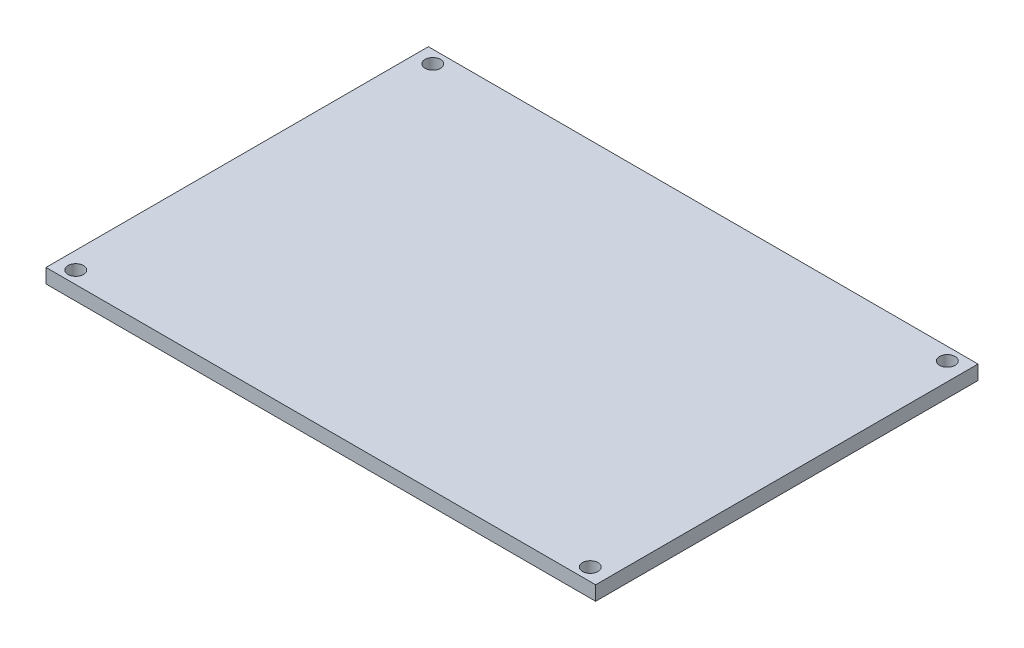
ISO-10303-21;
HEADER;
FILE_DESCRIPTION(('STEP AP214'),'2;1');
FILE_NAME('part.step','',(''),(''),'','','');
FILE_SCHEMA(('AUTOMOTIVE_DESIGN { 1 0 10303 214 1 1 1 1 }'));
ENDSEC;
DATA;
#1=APPLICATION_CONTEXT('core data for automotive mechanical design processes');
#2=APPLICATION_PROTOCOL_DEFINITION('international standard','automotive_design',2000,#1);
#3=PRODUCT_CONTEXT('',#1,'mechanical');
#4=PRODUCT('Part','Part','',(#3));
#5=PRODUCT_RELATED_PRODUCT_CATEGORY('part','',(#4));
#6=PRODUCT_DEFINITION_FORMATION('','',#4);
#7=PRODUCT_DEFINITION_CONTEXT('part definition',#1,'design');
#8=PRODUCT_DEFINITION('design','',#6,#7);
#9=PRODUCT_DEFINITION_SHAPE('','',#8);
#10=(LENGTH_UNIT() NAMED_UNIT(*) SI_UNIT(.MILLI.,.METRE.));
#11=(NAMED_UNIT(*) PLANE_ANGLE_UNIT() SI_UNIT($,.RADIAN.));
#12=(NAMED_UNIT(*) SI_UNIT($,.STERADIAN.) SOLID_ANGLE_UNIT());
#13=UNCERTAINTY_MEASURE_WITH_UNIT(LENGTH_MEASURE(1.E-05),#10,'distance_accuracy_value','');
#14=(GEOMETRIC_REPRESENTATION_CONTEXT(3) GLOBAL_UNCERTAINTY_ASSIGNED_CONTEXT((#13)) GLOBAL_UNIT_ASSIGNED_CONTEXT((#10,
#11,#12)) REPRESENTATION_CONTEXT('',''));
#15=CARTESIAN_POINT('',(0.,0.,0.));
#16=DIRECTION('',(0.,0.,1.));
#17=DIRECTION('',(1.,0.,0.));
#18=AXIS2_PLACEMENT_3D('',#15,#16,#17);
#19=CARTESIAN_POINT('',(-57.5,3.,-40.));
#20=DIRECTION('',(1.,0.,0.));
#21=DIRECTION('',(0.,0.,-1.));
#22=AXIS2_PLACEMENT_3D('',#19,#20,#21);
#23=PLANE('',#22);
#24=DIRECTION('',(0.,0.,1.));
#25=VECTOR('',#24,1.);
#26=CARTESIAN_POINT('',(-57.5,0.,-40.));
#27=LINE('',#26,#25);
#28=CARTESIAN_POINT('',(-57.5,0.,-40.));
#29=VERTEX_POINT('',#28);
#30=CARTESIAN_POINT('',(-57.5,0.,40.));
#31=VERTEX_POINT('',#30);
#32=EDGE_CURVE('E114',#29,#31,#27,.T.);
#33=ORIENTED_EDGE('',*,*,#32,.T.);
#34=DIRECTION('',(0.,-1.,0.));
#35=VECTOR('',#34,1.);
#36=CARTESIAN_POINT('',(-57.5,3.,40.));
#37=LINE('',#36,#35);
#38=CARTESIAN_POINT('',(-57.5,3.,40.));
#39=VERTEX_POINT('',#38);
#40=EDGE_CURVE('E12',#39,#31,#37,.T.);
#41=ORIENTED_EDGE('',*,*,#40,.F.);
#42=DIRECTION('',(0.,0.,1.));
#43=VECTOR('',#42,1.);
#44=CARTESIAN_POINT('',(-57.5,3.,-40.));
#45=LINE('',#44,#43);
#46=CARTESIAN_POINT('',(-57.5,3.,-40.));
#47=VERTEX_POINT('',#46);
#48=EDGE_CURVE('E96',#47,#39,#45,.T.);
#49=ORIENTED_EDGE('',*,*,#48,.F.);
#50=DIRECTION('',(0.,-1.,0.));
#51=VECTOR('',#50,1.);
#52=CARTESIAN_POINT('',(-57.5,3.,-40.));
#53=LINE('',#52,#51);
#54=EDGE_CURVE('E63',#47,#29,#53,.T.);
#55=ORIENTED_EDGE('',*,*,#54,.T.);
#56=EDGE_LOOP('',(#33,#41,#49,#55));
#57=FACE_BOUND('',#56,.T.);
#58=ADVANCED_FACE('F46',(#57),#23,.F.);
#59=CARTESIAN_POINT('',(-57.5,3.,40.));
#60=DIRECTION('',(0.,0.,-1.));
#61=DIRECTION('',(-1.,0.,0.));
#62=AXIS2_PLACEMENT_3D('',#59,#60,#61);
#63=PLANE('',#62);
#64=DIRECTION('',(1.,0.,0.));
#65=VECTOR('',#64,1.);
#66=CARTESIAN_POINT('',(-57.5,0.,40.));
#67=LINE('',#66,#65);
#68=CARTESIAN_POINT('',(57.5,0.,40.));
#69=VERTEX_POINT('',#68);
#70=EDGE_CURVE('E102',#31,#69,#67,.T.);
#71=ORIENTED_EDGE('',*,*,#70,.T.);
#72=DIRECTION('',(0.,-1.,0.));
#73=VECTOR('',#72,1.);
#74=CARTESIAN_POINT('',(57.5,3.,40.));
#75=LINE('',#74,#73);
#76=CARTESIAN_POINT('',(57.5,3.,40.));
#77=VERTEX_POINT('',#76);
#78=EDGE_CURVE('E55',#77,#69,#75,.T.);
#79=ORIENTED_EDGE('',*,*,#78,.F.);
#80=DIRECTION('',(1.,0.,0.));
#81=VECTOR('',#80,1.);
#82=CARTESIAN_POINT('',(-57.5,3.,40.));
#83=LINE('',#82,#81);
#84=EDGE_CURVE('E88',#39,#77,#83,.T.);
#85=ORIENTED_EDGE('',*,*,#84,.F.);
#86=ORIENTED_EDGE('',*,*,#40,.T.);
#87=EDGE_LOOP('',(#71,#79,#85,#86));
#88=FACE_BOUND('',#87,.T.);
#89=ADVANCED_FACE('F101',(#88),#63,.F.);
#90=CARTESIAN_POINT('',(57.5,3.,-40.));
#91=DIRECTION('',(1.,0.,0.));
#92=DIRECTION('',(0.,0.,-1.));
#93=AXIS2_PLACEMENT_3D('',#90,#91,#92);
#94=PLANE('',#93);
#95=DIRECTION('',(0.,0.,1.));
#96=VECTOR('',#95,1.);
#97=CARTESIAN_POINT('',(57.5,0.,-40.));
#98=LINE('',#97,#96);
#99=CARTESIAN_POINT('',(57.5,0.,-40.));
#100=VERTEX_POINT('',#99);
#101=EDGE_CURVE('E120',#100,#69,#98,.T.);
#102=ORIENTED_EDGE('',*,*,#101,.F.);
#103=DIRECTION('',(0.,-1.,0.));
#104=VECTOR('',#103,1.);
#105=CARTESIAN_POINT('',(57.5,3.,-40.));
#106=LINE('',#105,#104);
#107=CARTESIAN_POINT('',(57.5,3.,-40.));
#108=VERTEX_POINT('',#107);
#109=EDGE_CURVE('E77',#108,#100,#106,.T.);
#110=ORIENTED_EDGE('',*,*,#109,.F.);
#111=DIRECTION('',(0.,0.,1.));
#112=VECTOR('',#111,1.);
#113=CARTESIAN_POINT('',(57.5,3.,-40.));
#114=LINE('',#113,#112);
#115=EDGE_CURVE('E95',#108,#77,#114,.T.);
#116=ORIENTED_EDGE('',*,*,#115,.T.);
#117=ORIENTED_EDGE('',*,*,#78,.T.);
#118=EDGE_LOOP('',(#102,#110,#116,#117));
#119=FACE_BOUND('',#118,.T.);
#120=ADVANCED_FACE('F106',(#119),#94,.T.);
#121=CARTESIAN_POINT('',(-57.5,3.,-40.));
#122=DIRECTION('',(0.,0.,-1.));
#123=DIRECTION('',(-1.,0.,0.));
#124=AXIS2_PLACEMENT_3D('',#121,#122,#123);
#125=PLANE('',#124);
#126=DIRECTION('',(1.,0.,0.));
#127=VECTOR('',#126,1.);
#128=CARTESIAN_POINT('',(-57.5,0.,-40.));
#129=LINE('',#128,#127);
#130=EDGE_CURVE('E123',#29,#100,#129,.T.);
#131=ORIENTED_EDGE('',*,*,#130,.F.);
#132=ORIENTED_EDGE('',*,*,#54,.F.);
#133=DIRECTION('',(1.,0.,0.));
#134=VECTOR('',#133,1.);
#135=CARTESIAN_POINT('',(-57.5,3.,-40.));
#136=LINE('',#135,#134);
#137=EDGE_CURVE('E108',#47,#108,#136,.T.);
#138=ORIENTED_EDGE('',*,*,#137,.T.);
#139=ORIENTED_EDGE('',*,*,#109,.T.);
#140=EDGE_LOOP('',(#131,#132,#138,#139));
#141=FACE_BOUND('',#140,.T.);
#142=ADVANCED_FACE('F171',(#141),#125,.T.);
#143=CARTESIAN_POINT('',(0.,3.,0.));
#144=DIRECTION('',(0.,1.,0.));
#145=DIRECTION('',(0.,0.,1.));
#146=AXIS2_PLACEMENT_3D('',#143,#144,#145);
#147=PLANE('',#146);
#148=CARTESIAN_POINT('',(53.725,3.,-37.35));
#149=DIRECTION('',(0.,1.,0.));
#150=DIRECTION('',(0.,0.,1.));
#151=AXIS2_PLACEMENT_3D('',#148,#149,#150);
#152=CIRCLE('',#151,1.625);
#153=CARTESIAN_POINT('',(53.725,3.,-35.725));
#154=VERTEX_POINT('',#153);
#155=EDGE_CURVE('E137',#154,#154,#152,.T.);
#156=ORIENTED_EDGE('',*,*,#155,.F.);
#157=EDGE_LOOP('',(#156));
#158=FACE_BOUND('',#157,.T.);
#159=CARTESIAN_POINT('',(-53.925,3.,37.35));
#160=DIRECTION('',(0.,1.,0.));
#161=DIRECTION('',(0.,0.,1.));
#162=AXIS2_PLACEMENT_3D('',#159,#160,#161);
#163=CIRCLE('',#162,1.625);
#164=CARTESIAN_POINT('',(-53.925,3.,38.975));
#165=VERTEX_POINT('',#164);
#166=EDGE_CURVE('E145',#165,#165,#163,.T.);
#167=ORIENTED_EDGE('',*,*,#166,.F.);
#168=EDGE_LOOP('',(#167));
#169=FACE_BOUND('',#168,.T.);
#170=CARTESIAN_POINT('',(53.725,3.,37.35));
#171=DIRECTION('',(0.,1.,0.));
#172=DIRECTION('',(0.,0.,1.));
#173=AXIS2_PLACEMENT_3D('',#170,#171,#172);
#174=CIRCLE('',#173,1.625);
#175=CARTESIAN_POINT('',(53.725,3.,38.975));
#176=VERTEX_POINT('',#175);
#177=EDGE_CURVE('E146',#176,#176,#174,.T.);
#178=ORIENTED_EDGE('',*,*,#177,.F.);
#179=EDGE_LOOP('',(#178));
#180=FACE_BOUND('',#179,.T.);
#181=CARTESIAN_POINT('',(-53.925,3.,-37.35));
#182=DIRECTION('',(0.,1.,0.));
#183=DIRECTION('',(0.,0.,1.));
#184=AXIS2_PLACEMENT_3D('',#181,#182,#183);
#185=CIRCLE('',#184,1.625);
#186=CARTESIAN_POINT('',(-53.925,3.,-35.725));
#187=VERTEX_POINT('',#186);
#188=EDGE_CURVE('E117',#187,#187,#185,.T.);
#189=ORIENTED_EDGE('',*,*,#188,.F.);
#190=EDGE_LOOP('',(#189));
#191=FACE_BOUND('',#190,.T.);
#192=ORIENTED_EDGE('',*,*,#48,.T.);
#193=ORIENTED_EDGE('',*,*,#84,.T.);
#194=ORIENTED_EDGE('',*,*,#115,.F.);
#195=ORIENTED_EDGE('',*,*,#137,.F.);
#196=EDGE_LOOP('',(#192,#193,#194,#195));
#197=FACE_BOUND('',#196,.T.);
#198=ADVANCED_FACE('F92',(#158,#169,#180,#191,#197),#147,.T.);
#199=CARTESIAN_POINT('',(0.,0.,0.));
#200=DIRECTION('',(0.,1.,0.));
#201=DIRECTION('',(0.,0.,1.));
#202=AXIS2_PLACEMENT_3D('',#199,#200,#201);
#203=PLANE('',#202);
#204=CARTESIAN_POINT('',(53.725,0.,-37.35));
#205=DIRECTION('',(0.,1.,0.));
#206=DIRECTION('',(0.,0.,1.));
#207=AXIS2_PLACEMENT_3D('',#204,#205,#206);
#208=CIRCLE('',#207,1.625);
#209=CARTESIAN_POINT('',(53.725,0.,-35.725));
#210=VERTEX_POINT('',#209);
#211=EDGE_CURVE('E150',#210,#210,#208,.T.);
#212=ORIENTED_EDGE('',*,*,#211,.T.);
#213=EDGE_LOOP('',(#212));
#214=FACE_BOUND('',#213,.T.);
#215=CARTESIAN_POINT('',(-53.925,0.,37.35));
#216=DIRECTION('',(0.,1.,0.));
#217=DIRECTION('',(0.,0.,1.));
#218=AXIS2_PLACEMENT_3D('',#215,#216,#217);
#219=CIRCLE('',#218,1.625);
#220=CARTESIAN_POINT('',(-53.925,0.,38.975));
#221=VERTEX_POINT('',#220);
#222=EDGE_CURVE('E141',#221,#221,#219,.T.);
#223=ORIENTED_EDGE('',*,*,#222,.T.);
#224=EDGE_LOOP('',(#223));
#225=FACE_BOUND('',#224,.T.);
#226=CARTESIAN_POINT('',(53.725,0.,37.35));
#227=DIRECTION('',(0.,1.,0.));
#228=DIRECTION('',(0.,0.,1.));
#229=AXIS2_PLACEMENT_3D('',#226,#227,#228);
#230=CIRCLE('',#229,1.625);
#231=CARTESIAN_POINT('',(53.725,0.,38.975));
#232=VERTEX_POINT('',#231);
#233=EDGE_CURVE('E157',#232,#232,#230,.T.);
#234=ORIENTED_EDGE('',*,*,#233,.T.);
#235=EDGE_LOOP('',(#234));
#236=FACE_BOUND('',#235,.T.);
#237=CARTESIAN_POINT('',(-53.925,0.,-37.35));
#238=DIRECTION('',(0.,1.,0.));
#239=DIRECTION('',(0.,0.,1.));
#240=AXIS2_PLACEMENT_3D('',#237,#238,#239);
#241=CIRCLE('',#240,1.625);
#242=CARTESIAN_POINT('',(-53.925,0.,-35.725));
#243=VERTEX_POINT('',#242);
#244=EDGE_CURVE('E133',#243,#243,#241,.T.);
#245=ORIENTED_EDGE('',*,*,#244,.T.);
#246=EDGE_LOOP('',(#245));
#247=FACE_BOUND('',#246,.T.);
#248=ORIENTED_EDGE('',*,*,#32,.F.);
#249=ORIENTED_EDGE('',*,*,#130,.T.);
#250=ORIENTED_EDGE('',*,*,#101,.T.);
#251=ORIENTED_EDGE('',*,*,#70,.F.);
#252=EDGE_LOOP('',(#248,#249,#250,#251));
#253=FACE_BOUND('',#252,.T.);
#254=ADVANCED_FACE('F170',(#214,#225,#236,#247,#253),#203,.F.);
#255=CARTESIAN_POINT('',(-53.925,3.,-37.35));
#256=DIRECTION('',(0.,-1.,0.));
#257=DIRECTION('',(0.,0.,-1.));
#258=AXIS2_PLACEMENT_3D('',#255,#256,#257);
#259=CYLINDRICAL_SURFACE('',#258,1.625);
#260=ORIENTED_EDGE('',*,*,#188,.T.);
#261=EDGE_LOOP('',(#260));
#262=FACE_BOUND('',#261,.T.);
#263=ORIENTED_EDGE('',*,*,#244,.F.);
#264=EDGE_LOOP('',(#263));
#265=FACE_BOUND('',#264,.T.);
#266=ADVANCED_FACE('F176',(#262,#265),#259,.F.);
#267=CARTESIAN_POINT('',(53.725,3.,37.35));
#268=DIRECTION('',(0.,-1.,0.));
#269=DIRECTION('',(0.,0.,-1.));
#270=AXIS2_PLACEMENT_3D('',#267,#268,#269);
#271=CYLINDRICAL_SURFACE('',#270,1.625);
#272=ORIENTED_EDGE('',*,*,#177,.T.);
#273=EDGE_LOOP('',(#272));
#274=FACE_BOUND('',#273,.T.);
#275=ORIENTED_EDGE('',*,*,#233,.F.);
#276=EDGE_LOOP('',(#275));
#277=FACE_BOUND('',#276,.T.);
#278=ADVANCED_FACE('F165',(#274,#277),#271,.F.);
#279=CARTESIAN_POINT('',(-53.925,3.,37.35));
#280=DIRECTION('',(0.,-1.,0.));
#281=DIRECTION('',(0.,0.,-1.));
#282=AXIS2_PLACEMENT_3D('',#279,#280,#281);
#283=CYLINDRICAL_SURFACE('',#282,1.625);
#284=ORIENTED_EDGE('',*,*,#166,.T.);
#285=EDGE_LOOP('',(#284));
#286=FACE_BOUND('',#285,.T.);
#287=ORIENTED_EDGE('',*,*,#222,.F.);
#288=EDGE_LOOP('',(#287));
#289=FACE_BOUND('',#288,.T.);
#290=ADVANCED_FACE('F234',(#286,#289),#283,.F.);
#291=CARTESIAN_POINT('',(53.725,3.,-37.35));
#292=DIRECTION('',(0.,-1.,0.));
#293=DIRECTION('',(0.,0.,-1.));
#294=AXIS2_PLACEMENT_3D('',#291,#292,#293);
#295=CYLINDRICAL_SURFACE('',#294,1.625);
#296=ORIENTED_EDGE('',*,*,#155,.T.);
#297=EDGE_LOOP('',(#296));
#298=FACE_BOUND('',#297,.T.);
#299=ORIENTED_EDGE('',*,*,#211,.F.);
#300=EDGE_LOOP('',(#299));
#301=FACE_BOUND('',#300,.T.);
#302=ADVANCED_FACE('F243',(#298,#301),#295,.F.);
#303=CLOSED_SHELL('',(#58,#89,#120,#142,#198,#254,#266,#278,#290,#302));
#304=MANIFOLD_SOLID_BREP('B2',#303);
#305=ADVANCED_BREP_SHAPE_REPRESENTATION('',(#18,#304),#14);
#306=SHAPE_DEFINITION_REPRESENTATION(#9,#305);
ENDSEC;
END-ISO-10303-21;
